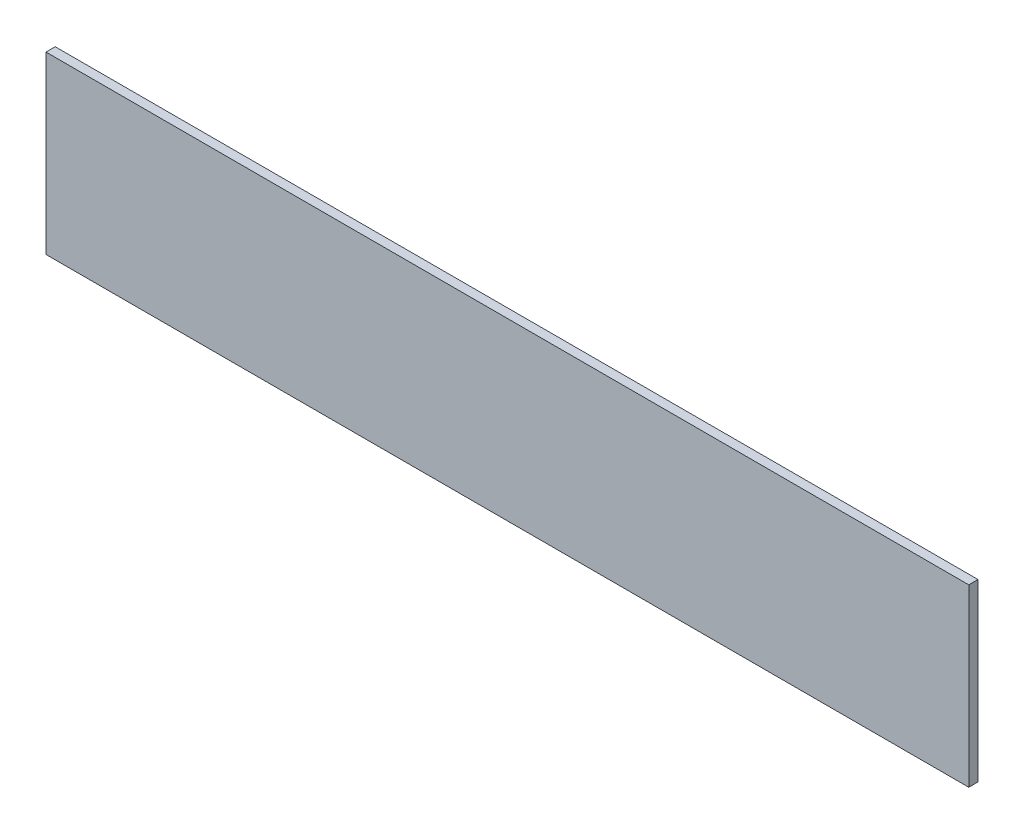
ISO-10303-21;
HEADER;
FILE_DESCRIPTION(('STEP AP214'),'2;1');
FILE_NAME('part.step','',(''),(''),'','','');
FILE_SCHEMA(('AUTOMOTIVE_DESIGN { 1 0 10303 214 1 1 1 1 }'));
ENDSEC;
DATA;
#1=APPLICATION_CONTEXT('core data for automotive mechanical design processes');
#2=APPLICATION_PROTOCOL_DEFINITION('international standard','automotive_design',2000,#1);
#3=PRODUCT_CONTEXT('',#1,'mechanical');
#4=PRODUCT('Part','Part','',(#3));
#5=PRODUCT_RELATED_PRODUCT_CATEGORY('part','',(#4));
#6=PRODUCT_DEFINITION_FORMATION('','',#4);
#7=PRODUCT_DEFINITION_CONTEXT('part definition',#1,'design');
#8=PRODUCT_DEFINITION('design','',#6,#7);
#9=PRODUCT_DEFINITION_SHAPE('','',#8);
#10=(LENGTH_UNIT() NAMED_UNIT(*) SI_UNIT(.MILLI.,.METRE.));
#11=(NAMED_UNIT(*) PLANE_ANGLE_UNIT() SI_UNIT($,.RADIAN.));
#12=(NAMED_UNIT(*) SI_UNIT($,.STERADIAN.) SOLID_ANGLE_UNIT());
#13=UNCERTAINTY_MEASURE_WITH_UNIT(LENGTH_MEASURE(1.E-05),#10,'distance_accuracy_value','');
#14=(GEOMETRIC_REPRESENTATION_CONTEXT(3) GLOBAL_UNCERTAINTY_ASSIGNED_CONTEXT((#13)) GLOBAL_UNIT_ASSIGNED_CONTEXT((#10,
#11,#12)) REPRESENTATION_CONTEXT('',''));
#15=CARTESIAN_POINT('',(0.,0.,0.));
#16=DIRECTION('',(0.,0.,1.));
#17=DIRECTION('',(1.,0.,0.));
#18=AXIS2_PLACEMENT_3D('',#15,#16,#17);
#19=CARTESIAN_POINT('',(-240.601503759398,167.413383730631,5.));
#20=DIRECTION('',(1.,0.,0.));
#21=DIRECTION('',(0.,1.,0.));
#22=AXIS2_PLACEMENT_3D('',#19,#20,#21);
#23=PLANE('',#22);
#24=DIRECTION('',(0.,-1.,0.));
#25=VECTOR('',#24,1.);
#26=CARTESIAN_POINT('',(-240.601503759398,167.413383730631,0.));
#27=LINE('',#26,#25);
#28=CARTESIAN_POINT('',(-240.601503759398,167.413383730631,0.));
#29=VERTEX_POINT('',#28);
#30=CARTESIAN_POINT('',(-240.601503759398,72.413383730631,0.));
#31=VERTEX_POINT('',#30);
#32=EDGE_CURVE('E106',#29,#31,#27,.T.);
#33=ORIENTED_EDGE('',*,*,#32,.T.);
#34=DIRECTION('',(0.,0.,-1.));
#35=VECTOR('',#34,1.);
#36=CARTESIAN_POINT('',(-240.601503759398,72.413383730631,5.));
#37=LINE('',#36,#35);
#38=CARTESIAN_POINT('',(-240.601503759398,72.413383730631,5.));
#39=VERTEX_POINT('',#38);
#40=EDGE_CURVE('E11',#39,#31,#37,.T.);
#41=ORIENTED_EDGE('',*,*,#40,.F.);
#42=DIRECTION('',(0.,-1.,0.));
#43=VECTOR('',#42,1.);
#44=CARTESIAN_POINT('',(-240.601503759398,167.413383730631,5.));
#45=LINE('',#44,#43);
#46=CARTESIAN_POINT('',(-240.601503759398,167.413383730631,5.));
#47=VERTEX_POINT('',#46);
#48=EDGE_CURVE('E94',#47,#39,#45,.T.);
#49=ORIENTED_EDGE('',*,*,#48,.F.);
#50=DIRECTION('',(0.,0.,-1.));
#51=VECTOR('',#50,1.);
#52=CARTESIAN_POINT('',(-240.601503759398,167.413383730631,5.));
#53=LINE('',#52,#51);
#54=EDGE_CURVE('E102',#47,#29,#53,.T.);
#55=ORIENTED_EDGE('',*,*,#54,.T.);
#56=EDGE_LOOP('',(#33,#41,#49,#55));
#57=FACE_BOUND('',#56,.T.);
#58=ADVANCED_FACE('F43',(#57),#23,.F.);
#59=CARTESIAN_POINT('',(-240.601503759398,72.413383730631,5.));
#60=DIRECTION('',(0.,1.,0.));
#61=DIRECTION('',(0.,0.,1.));
#62=AXIS2_PLACEMENT_3D('',#59,#60,#61);
#63=PLANE('',#62);
#64=DIRECTION('',(1.,0.,0.));
#65=VECTOR('',#64,1.);
#66=CARTESIAN_POINT('',(-240.601503759398,72.413383730631,0.));
#67=LINE('',#66,#65);
#68=CARTESIAN_POINT('',(259.398496240602,72.413383730631,0.));
#69=VERTEX_POINT('',#68);
#70=EDGE_CURVE('E98',#31,#69,#67,.T.);
#71=ORIENTED_EDGE('',*,*,#70,.T.);
#72=DIRECTION('',(0.,0.,-1.));
#73=VECTOR('',#72,1.);
#74=CARTESIAN_POINT('',(259.398496240602,72.413383730631,5.));
#75=LINE('',#74,#73);
#76=CARTESIAN_POINT('',(259.398496240602,72.413383730631,5.));
#77=VERTEX_POINT('',#76);
#78=EDGE_CURVE('E51',#77,#69,#75,.T.);
#79=ORIENTED_EDGE('',*,*,#78,.F.);
#80=DIRECTION('',(1.,0.,0.));
#81=VECTOR('',#80,1.);
#82=CARTESIAN_POINT('',(-240.601503759398,72.413383730631,5.));
#83=LINE('',#82,#81);
#84=EDGE_CURVE('E89',#39,#77,#83,.T.);
#85=ORIENTED_EDGE('',*,*,#84,.F.);
#86=ORIENTED_EDGE('',*,*,#40,.T.);
#87=EDGE_LOOP('',(#71,#79,#85,#86));
#88=FACE_BOUND('',#87,.T.);
#89=ADVANCED_FACE('F97',(#88),#63,.F.);
#90=CARTESIAN_POINT('',(259.398496240602,167.413383730631,5.));
#91=DIRECTION('',(-1.,0.,0.));
#92=DIRECTION('',(0.,-1.,0.));
#93=AXIS2_PLACEMENT_3D('',#90,#91,#92);
#94=PLANE('',#93);
#95=DIRECTION('',(0.,1.,0.));
#96=VECTOR('',#95,1.);
#97=CARTESIAN_POINT('',(259.398496240602,167.413383730631,0.));
#98=LINE('',#97,#96);
#99=CARTESIAN_POINT('',(259.398496240602,167.413383730631,0.));
#100=VERTEX_POINT('',#99);
#101=EDGE_CURVE('E76',#69,#100,#98,.T.);
#102=ORIENTED_EDGE('',*,*,#101,.T.);
#103=DIRECTION('',(0.,0.,-1.));
#104=VECTOR('',#103,1.);
#105=CARTESIAN_POINT('',(259.398496240602,167.413383730631,5.));
#106=LINE('',#105,#104);
#107=CARTESIAN_POINT('',(259.398496240602,167.413383730631,5.));
#108=VERTEX_POINT('',#107);
#109=EDGE_CURVE('E99',#108,#100,#106,.T.);
#110=ORIENTED_EDGE('',*,*,#109,.F.);
#111=DIRECTION('',(0.,1.,0.));
#112=VECTOR('',#111,1.);
#113=CARTESIAN_POINT('',(259.398496240602,167.413383730631,5.));
#114=LINE('',#113,#112);
#115=EDGE_CURVE('E92',#77,#108,#114,.T.);
#116=ORIENTED_EDGE('',*,*,#115,.F.);
#117=ORIENTED_EDGE('',*,*,#78,.T.);
#118=EDGE_LOOP('',(#102,#110,#116,#117));
#119=FACE_BOUND('',#118,.T.);
#120=ADVANCED_FACE('F100',(#119),#94,.F.);
#121=CARTESIAN_POINT('',(-240.601503759398,167.413383730631,5.));
#122=DIRECTION('',(0.,-1.,0.));
#123=DIRECTION('',(0.,0.,-1.));
#124=AXIS2_PLACEMENT_3D('',#121,#122,#123);
#125=PLANE('',#124);
#126=DIRECTION('',(-1.,0.,0.));
#127=VECTOR('',#126,1.);
#128=CARTESIAN_POINT('',(-240.601503759398,167.413383730631,0.));
#129=LINE('',#128,#127);
#130=EDGE_CURVE('E82',#100,#29,#129,.T.);
#131=ORIENTED_EDGE('',*,*,#130,.T.);
#132=ORIENTED_EDGE('',*,*,#54,.F.);
#133=DIRECTION('',(-1.,0.,0.));
#134=VECTOR('',#133,1.);
#135=CARTESIAN_POINT('',(-240.601503759398,167.413383730631,5.));
#136=LINE('',#135,#134);
#137=EDGE_CURVE('E59',#108,#47,#136,.T.);
#138=ORIENTED_EDGE('',*,*,#137,.F.);
#139=ORIENTED_EDGE('',*,*,#109,.T.);
#140=EDGE_LOOP('',(#131,#132,#138,#139));
#141=FACE_BOUND('',#140,.T.);
#142=ADVANCED_FACE('F113',(#141),#125,.F.);
#143=CARTESIAN_POINT('',(0.,0.,5.));
#144=DIRECTION('',(0.,0.,1.));
#145=DIRECTION('',(1.,0.,0.));
#146=AXIS2_PLACEMENT_3D('',#143,#144,#145);
#147=PLANE('',#146);
#148=ORIENTED_EDGE('',*,*,#48,.T.);
#149=ORIENTED_EDGE('',*,*,#84,.T.);
#150=ORIENTED_EDGE('',*,*,#115,.T.);
#151=ORIENTED_EDGE('',*,*,#137,.T.);
#152=EDGE_LOOP('',(#148,#149,#150,#151));
#153=FACE_BOUND('',#152,.T.);
#154=ADVANCED_FACE('F90',(#153),#147,.T.);
#155=CARTESIAN_POINT('',(0.,0.,0.));
#156=DIRECTION('',(0.,0.,1.));
#157=DIRECTION('',(1.,0.,0.));
#158=AXIS2_PLACEMENT_3D('',#155,#156,#157);
#159=PLANE('',#158);
#160=ORIENTED_EDGE('',*,*,#32,.F.);
#161=ORIENTED_EDGE('',*,*,#130,.F.);
#162=ORIENTED_EDGE('',*,*,#101,.F.);
#163=ORIENTED_EDGE('',*,*,#70,.F.);
#164=EDGE_LOOP('',(#160,#161,#162,#163));
#165=FACE_BOUND('',#164,.T.);
#166=ADVANCED_FACE('F116',(#165),#159,.F.);
#167=CLOSED_SHELL('',(#58,#89,#120,#142,#154,#166));
#168=MANIFOLD_SOLID_BREP('B2',#167);
#169=ADVANCED_BREP_SHAPE_REPRESENTATION('',(#18,#168),#14);
#170=SHAPE_DEFINITION_REPRESENTATION(#9,#169);
ENDSEC;
END-ISO-10303-21;
